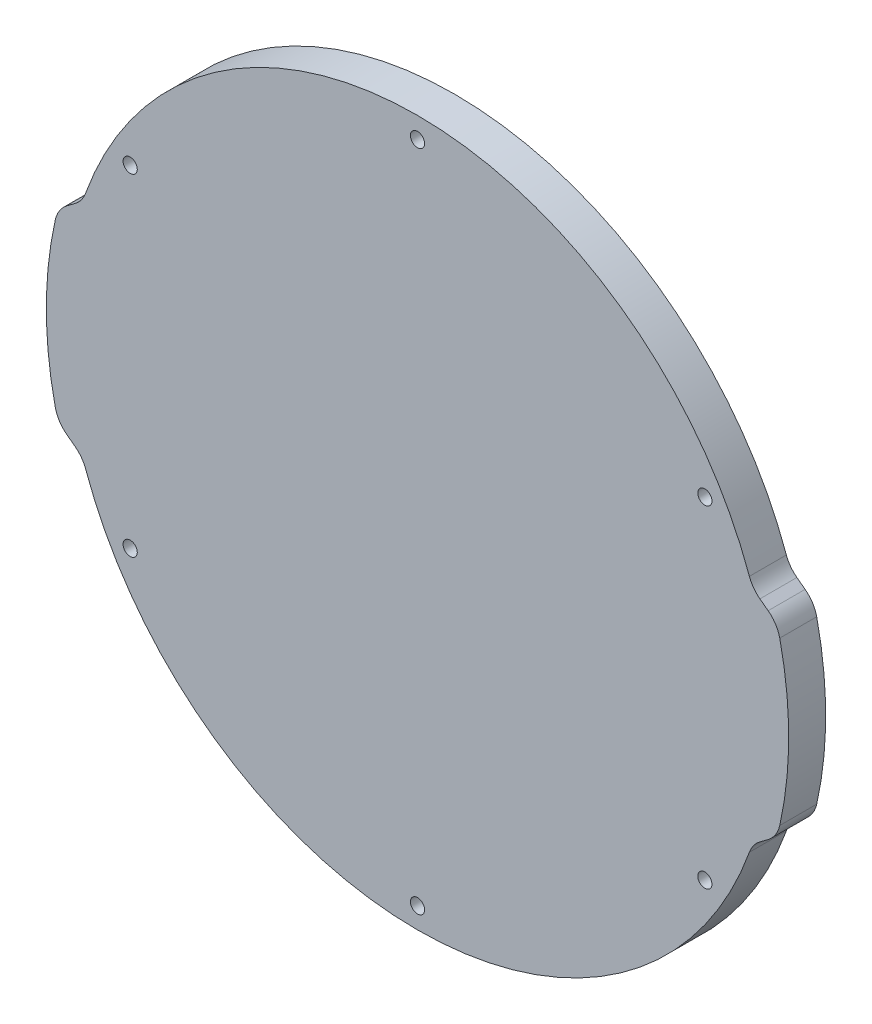
ISO-10303-21;
HEADER;
FILE_DESCRIPTION(('STEP AP214'),'2;1');
FILE_NAME('part.step','',(''),(''),'','','');
FILE_SCHEMA(('AUTOMOTIVE_DESIGN { 1 0 10303 214 1 1 1 1 }'));
ENDSEC;
DATA;
#1=APPLICATION_CONTEXT('core data for automotive mechanical design processes');
#2=APPLICATION_PROTOCOL_DEFINITION('international standard','automotive_design',2000,#1);
#3=PRODUCT_CONTEXT('',#1,'mechanical');
#4=PRODUCT('Part','Part','',(#3));
#5=PRODUCT_RELATED_PRODUCT_CATEGORY('part','',(#4));
#6=PRODUCT_DEFINITION_FORMATION('','',#4);
#7=PRODUCT_DEFINITION_CONTEXT('part definition',#1,'design');
#8=PRODUCT_DEFINITION('design','',#6,#7);
#9=PRODUCT_DEFINITION_SHAPE('','',#8);
#10=(LENGTH_UNIT() NAMED_UNIT(*) SI_UNIT(.MILLI.,.METRE.));
#11=(NAMED_UNIT(*) PLANE_ANGLE_UNIT() SI_UNIT($,.RADIAN.));
#12=(NAMED_UNIT(*) SI_UNIT($,.STERADIAN.) SOLID_ANGLE_UNIT());
#13=UNCERTAINTY_MEASURE_WITH_UNIT(LENGTH_MEASURE(1.E-05),#10,'distance_accuracy_value','');
#14=(GEOMETRIC_REPRESENTATION_CONTEXT(3) GLOBAL_UNCERTAINTY_ASSIGNED_CONTEXT((#13)) GLOBAL_UNIT_ASSIGNED_CONTEXT((#10,
#11,#12)) REPRESENTATION_CONTEXT('',''));
#15=CARTESIAN_POINT('',(0.,0.,0.));
#16=DIRECTION('',(0.,0.,1.));
#17=DIRECTION('',(1.,0.,0.));
#18=AXIS2_PLACEMENT_3D('',#15,#16,#17);
#19=CARTESIAN_POINT('',(0.,0.,6.));
#20=DIRECTION('',(0.,0.,1.));
#21=DIRECTION('',(1.,0.,0.));
#22=AXIS2_PLACEMENT_3D('',#19,#20,#21);
#23=PLANE('',#22);
#24=CARTESIAN_POINT('',(-46.6354679937874,-26.9250000000027,6.));
#25=DIRECTION('',(0.,0.,1.));
#26=DIRECTION('',(1.,0.,0.));
#27=AXIS2_PLACEMENT_3D('',#24,#25,#26);
#28=CIRCLE('',#27,1.15000000000566);
#29=CARTESIAN_POINT('',(-45.4854679937818,-26.9250000000027,6.));
#30=VERTEX_POINT('',#29);
#31=EDGE_CURVE('E317',#30,#30,#28,.T.);
#32=ORIENTED_EDGE('',*,*,#31,.F.);
#33=EDGE_LOOP('',(#32));
#34=FACE_BOUND('',#33,.T.);
#35=CARTESIAN_POINT('',(46.6354679937966,-26.9249999999973,6.));
#36=DIRECTION('',(0.,0.,1.));
#37=DIRECTION('',(1.,0.,0.));
#38=AXIS2_PLACEMENT_3D('',#35,#36,#37);
#39=CIRCLE('',#38,1.15000000000386);
#40=CARTESIAN_POINT('',(47.7854679938005,-26.9249999999973,6.));
#41=VERTEX_POINT('',#40);
#42=EDGE_CURVE('E305',#41,#41,#39,.T.);
#43=ORIENTED_EDGE('',*,*,#42,.F.);
#44=EDGE_LOOP('',(#43));
#45=FACE_BOUND('',#44,.T.);
#46=CARTESIAN_POINT('',(0.,53.85,6.));
#47=DIRECTION('',(0.,0.,1.));
#48=DIRECTION('',(1.,0.,0.));
#49=AXIS2_PLACEMENT_3D('',#46,#47,#48);
#50=CIRCLE('',#49,1.15);
#51=CARTESIAN_POINT('',(1.15,53.85,6.));
#52=VERTEX_POINT('',#51);
#53=EDGE_CURVE('E275',#52,#52,#50,.T.);
#54=ORIENTED_EDGE('',*,*,#53,.F.);
#55=EDGE_LOOP('',(#54));
#56=FACE_BOUND('',#55,.T.);
#57=DIRECTION('',(-0.800447556206134,-0.599402794257441,0.));
#58=VECTOR('',#57,1.);
#59=CARTESIAN_POINT('',(-58.3529133805674,15.,6.));
#60=LINE('',#59,#58);
#61=CARTESIAN_POINT('',(-55.5739785892829,17.0809624141399,6.));
#62=VERTEX_POINT('',#61);
#63=CARTESIAN_POINT('',(-56.9107570593107,16.0799364955455,6.));
#64=VERTEX_POINT('',#63);
#65=EDGE_CURVE('E168',#62,#64,#60,.T.);
#66=ORIENTED_EDGE('',*,*,#65,.T.);
#67=CARTESIAN_POINT('',(-53.9137430880235,12.0776987145149,6.));
#68=DIRECTION('',(0.,0.,1.));
#69=DIRECTION('',(1.,0.,0.));
#70=AXIS2_PLACEMENT_3D('',#67,#68,#69);
#71=CIRCLE('',#70,5.);
#72=CARTESIAN_POINT('',(-58.7928148606954,13.1707031230682,6.));
#73=VERTEX_POINT('',#72);
#74=EDGE_CURVE('E210',#64,#73,#71,.T.);
#75=ORIENTED_EDGE('',*,*,#74,.T.);
#76=CARTESIAN_POINT('',(0.,0.,6.));
#77=DIRECTION('',(0.,0.,1.));
#78=DIRECTION('',(1.,0.,0.));
#79=AXIS2_PLACEMENT_3D('',#76,#77,#78);
#80=CIRCLE('',#79,60.25);
#81=CARTESIAN_POINT('',(-58.7928148606953,-13.1707031230683,6.));
#82=VERTEX_POINT('',#81);
#83=EDGE_CURVE('E263',#73,#82,#80,.T.);
#84=ORIENTED_EDGE('',*,*,#83,.T.);
#85=CARTESIAN_POINT('',(-53.9137430880235,-12.0776987145149,6.));
#86=DIRECTION('',(0.,0.,1.));
#87=DIRECTION('',(1.,0.,0.));
#88=AXIS2_PLACEMENT_3D('',#85,#86,#87);
#89=CIRCLE('',#88,5.);
#90=CARTESIAN_POINT('',(-56.9107570593107,-16.0799364955456,6.));
#91=VERTEX_POINT('',#90);
#92=EDGE_CURVE('E56',#82,#91,#89,.T.);
#93=ORIENTED_EDGE('',*,*,#92,.T.);
#94=DIRECTION('',(0.800447556206134,-0.599402794257441,0.));
#95=VECTOR('',#94,1.);
#96=CARTESIAN_POINT('',(-58.3529133805674,-15.,6.));
#97=LINE('',#96,#95);
#98=CARTESIAN_POINT('',(-55.5739785892829,-17.08096241414,6.));
#99=VERTEX_POINT('',#98);
#100=EDGE_CURVE('E188',#91,#99,#97,.T.);
#101=ORIENTED_EDGE('',*,*,#100,.T.);
#102=CARTESIAN_POINT('',(-58.5709925605701,-21.0832001951707,6.));
#103=DIRECTION('',(0.,0.,1.));
#104=DIRECTION('',(1.,0.,0.));
#105=AXIS2_PLACEMENT_3D('',#102,#103,#104);
#106=CIRCLE('',#105,5.);
#107=CARTESIAN_POINT('',(-53.8664951661468,-19.3897704606188,6.));
#108=VERTEX_POINT('',#107);
#109=EDGE_CURVE('E238',#99,#108,#106,.F.);
#110=ORIENTED_EDGE('',*,*,#109,.T.);
#111=CARTESIAN_POINT('',(0.,0.,6.));
#112=DIRECTION('',(0.,0.,1.));
#113=DIRECTION('',(1.,0.,0.));
#114=AXIS2_PLACEMENT_3D('',#111,#112,#113);
#115=CIRCLE('',#114,57.25);
#116=CARTESIAN_POINT('',(53.8664951661468,-19.3897704606188,6.));
#117=VERTEX_POINT('',#116);
#118=EDGE_CURVE('E187',#108,#117,#115,.T.);
#119=ORIENTED_EDGE('',*,*,#118,.T.);
#120=CARTESIAN_POINT('',(58.5709925605701,-21.0832001951706,6.));
#121=DIRECTION('',(0.,0.,1.));
#122=DIRECTION('',(1.,0.,0.));
#123=AXIS2_PLACEMENT_3D('',#120,#121,#122);
#124=CIRCLE('',#123,5.);
#125=CARTESIAN_POINT('',(55.5739785892829,-17.0809624141399,6.));
#126=VERTEX_POINT('',#125);
#127=EDGE_CURVE('E242',#117,#126,#124,.F.);
#128=ORIENTED_EDGE('',*,*,#127,.T.);
#129=DIRECTION('',(0.800447556206134,0.599402794257441,0.));
#130=VECTOR('',#129,1.);
#131=CARTESIAN_POINT('',(54.3466880315627,-18.,6.));
#132=LINE('',#131,#130);
#133=CARTESIAN_POINT('',(56.9107570593107,-16.0799364955456,6.));
#134=VERTEX_POINT('',#133);
#135=EDGE_CURVE('E291',#126,#134,#132,.T.);
#136=ORIENTED_EDGE('',*,*,#135,.T.);
#137=CARTESIAN_POINT('',(53.9137430880235,-12.0776987145149,6.));
#138=DIRECTION('',(0.,0.,1.));
#139=DIRECTION('',(1.,0.,0.));
#140=AXIS2_PLACEMENT_3D('',#137,#138,#139);
#141=CIRCLE('',#140,5.);
#142=CARTESIAN_POINT('',(58.7928148606953,-13.1707031230683,6.));
#143=VERTEX_POINT('',#142);
#144=EDGE_CURVE('E207',#134,#143,#141,.T.);
#145=ORIENTED_EDGE('',*,*,#144,.T.);
#146=CARTESIAN_POINT('',(0.,0.,6.));
#147=DIRECTION('',(0.,0.,1.));
#148=DIRECTION('',(-1.,0.,0.));
#149=AXIS2_PLACEMENT_3D('',#146,#147,#148);
#150=CIRCLE('',#149,60.2500000000001);
#151=CARTESIAN_POINT('',(58.7928148606953,13.1707031230683,6.));
#152=VERTEX_POINT('',#151);
#153=EDGE_CURVE('E265',#143,#152,#150,.T.);
#154=ORIENTED_EDGE('',*,*,#153,.T.);
#155=CARTESIAN_POINT('',(53.9137430880235,12.0776987145149,6.));
#156=DIRECTION('',(0.,0.,1.));
#157=DIRECTION('',(1.,0.,0.));
#158=AXIS2_PLACEMENT_3D('',#155,#156,#157);
#159=CIRCLE('',#158,5.);
#160=CARTESIAN_POINT('',(56.9107570593107,16.0799364955455,6.));
#161=VERTEX_POINT('',#160);
#162=EDGE_CURVE('E205',#152,#161,#159,.T.);
#163=ORIENTED_EDGE('',*,*,#162,.T.);
#164=DIRECTION('',(-0.800447556206134,0.599402794257441,0.));
#165=VECTOR('',#164,1.);
#166=CARTESIAN_POINT('',(58.3529133805674,15.,6.));
#167=LINE('',#166,#165);
#168=CARTESIAN_POINT('',(55.5739785892829,17.0809624141399,6.));
#169=VERTEX_POINT('',#168);
#170=EDGE_CURVE('E259',#161,#169,#167,.T.);
#171=ORIENTED_EDGE('',*,*,#170,.T.);
#172=CARTESIAN_POINT('',(58.5709925605701,21.0832001951706,6.));
#173=DIRECTION('',(0.,0.,1.));
#174=DIRECTION('',(1.,0.,0.));
#175=AXIS2_PLACEMENT_3D('',#172,#173,#174);
#176=CIRCLE('',#175,5.);
#177=CARTESIAN_POINT('',(53.8664951661468,19.3897704606188,6.));
#178=VERTEX_POINT('',#177);
#179=EDGE_CURVE('E11',#169,#178,#176,.F.);
#180=ORIENTED_EDGE('',*,*,#179,.T.);
#181=CARTESIAN_POINT('',(0.,0.,6.));
#182=DIRECTION('',(0.,0.,1.));
#183=DIRECTION('',(-1.,0.,0.));
#184=AXIS2_PLACEMENT_3D('',#181,#182,#183);
#185=CIRCLE('',#184,57.25);
#186=CARTESIAN_POINT('',(-53.8664951661468,19.3897704606188,6.));
#187=VERTEX_POINT('',#186);
#188=EDGE_CURVE('E258',#178,#187,#185,.T.);
#189=ORIENTED_EDGE('',*,*,#188,.T.);
#190=CARTESIAN_POINT('',(-58.5709925605701,21.0832001951706,6.));
#191=DIRECTION('',(0.,0.,1.));
#192=DIRECTION('',(1.,0.,0.));
#193=AXIS2_PLACEMENT_3D('',#190,#191,#192);
#194=CIRCLE('',#193,5.);
#195=EDGE_CURVE('E158',#187,#62,#194,.F.);
#196=ORIENTED_EDGE('',*,*,#195,.T.);
#197=EDGE_LOOP('',(#66,#75,#84,#93,#101,#110,#119,#128,#136,#145,#154,#163,#171,#180,#189,#196));
#198=FACE_BOUND('',#197,.T.);
#199=CARTESIAN_POINT('',(46.6354679937935,26.9250000000027,6.));
#200=DIRECTION('',(0.,0.,1.));
#201=DIRECTION('',(1.,0.,0.));
#202=AXIS2_PLACEMENT_3D('',#199,#200,#201);
#203=CIRCLE('',#202,1.15000000000082);
#204=CARTESIAN_POINT('',(47.7854679937944,26.9250000000027,6.));
#205=VERTEX_POINT('',#204);
#206=EDGE_CURVE('E299',#205,#205,#203,.T.);
#207=ORIENTED_EDGE('',*,*,#206,.F.);
#208=EDGE_LOOP('',(#207));
#209=FACE_BOUND('',#208,.T.);
#210=CARTESIAN_POINT('',(6.10884676528221E-12,-53.85,6.));
#211=DIRECTION('',(0.,0.,1.));
#212=DIRECTION('',(1.,0.,0.));
#213=AXIS2_PLACEMENT_3D('',#210,#211,#212);
#214=CIRCLE('',#213,1.1500000000062);
#215=CARTESIAN_POINT('',(1.15000000001231,-53.85,6.));
#216=VERTEX_POINT('',#215);
#217=EDGE_CURVE('E311',#216,#216,#214,.T.);
#218=ORIENTED_EDGE('',*,*,#217,.F.);
#219=EDGE_LOOP('',(#218));
#220=FACE_BOUND('',#219,.T.);
#221=CARTESIAN_POINT('',(-46.6354679937905,26.9249999999973,6.));
#222=DIRECTION('',(0.,0.,1.));
#223=DIRECTION('',(1.,0.,0.));
#224=AXIS2_PLACEMENT_3D('',#221,#222,#223);
#225=CIRCLE('',#224,1.15000000000287);
#226=CARTESIAN_POINT('',(-45.4854679937876,26.9249999999973,6.));
#227=VERTEX_POINT('',#226);
#228=EDGE_CURVE('E323',#227,#227,#225,.T.);
#229=ORIENTED_EDGE('',*,*,#228,.F.);
#230=EDGE_LOOP('',(#229));
#231=FACE_BOUND('',#230,.T.);
#232=ADVANCED_FACE('F34',(#34,#45,#56,#198,#209,#220,#231),#23,.T.);
#233=CARTESIAN_POINT('',(0.,0.,0.));
#234=DIRECTION('',(0.,0.,1.));
#235=DIRECTION('',(1.,0.,0.));
#236=AXIS2_PLACEMENT_3D('',#233,#234,#235);
#237=PLANE('',#236);
#238=CARTESIAN_POINT('',(0.,0.,0.));
#239=DIRECTION('',(0.,0.,1.));
#240=DIRECTION('',(1.,0.,0.));
#241=AXIS2_PLACEMENT_3D('',#238,#239,#240);
#242=CIRCLE('',#241,60.25);
#243=CARTESIAN_POINT('',(-58.7928148606954,13.1707031230682,0.));
#244=VERTEX_POINT('',#243);
#245=CARTESIAN_POINT('',(-58.7928148606953,-13.1707031230683,0.));
#246=VERTEX_POINT('',#245);
#247=EDGE_CURVE('E176',#244,#246,#242,.T.);
#248=ORIENTED_EDGE('',*,*,#247,.F.);
#249=CARTESIAN_POINT('',(-53.9137430880235,12.0776987145149,0.));
#250=DIRECTION('',(0.,0.,1.));
#251=DIRECTION('',(1.,0.,0.));
#252=AXIS2_PLACEMENT_3D('',#249,#250,#251);
#253=CIRCLE('',#252,5.);
#254=CARTESIAN_POINT('',(-56.9107570593107,16.0799364955455,0.));
#255=VERTEX_POINT('',#254);
#256=EDGE_CURVE('E175',#244,#255,#253,.F.);
#257=ORIENTED_EDGE('',*,*,#256,.T.);
#258=DIRECTION('',(-0.800447556206134,-0.599402794257441,0.));
#259=VECTOR('',#258,1.);
#260=CARTESIAN_POINT('',(-58.3529133805674,15.,0.));
#261=LINE('',#260,#259);
#262=CARTESIAN_POINT('',(-55.5739785892829,17.0809624141399,0.));
#263=VERTEX_POINT('',#262);
#264=EDGE_CURVE('E165',#263,#255,#261,.T.);
#265=ORIENTED_EDGE('',*,*,#264,.F.);
#266=CARTESIAN_POINT('',(-58.5709925605701,21.0832001951706,0.));
#267=DIRECTION('',(0.,0.,1.));
#268=DIRECTION('',(1.,0.,0.));
#269=AXIS2_PLACEMENT_3D('',#266,#267,#268);
#270=CIRCLE('',#269,5.);
#271=CARTESIAN_POINT('',(-53.8664951661468,19.3897704606188,0.));
#272=VERTEX_POINT('',#271);
#273=EDGE_CURVE('E148',#263,#272,#270,.T.);
#274=ORIENTED_EDGE('',*,*,#273,.T.);
#275=CARTESIAN_POINT('',(0.,0.,0.));
#276=DIRECTION('',(0.,0.,1.));
#277=DIRECTION('',(-1.,0.,0.));
#278=AXIS2_PLACEMENT_3D('',#275,#276,#277);
#279=CIRCLE('',#278,57.25);
#280=CARTESIAN_POINT('',(53.8664951661468,19.3897704606188,0.));
#281=VERTEX_POINT('',#280);
#282=EDGE_CURVE('E177',#281,#272,#279,.T.);
#283=ORIENTED_EDGE('',*,*,#282,.F.);
#284=CARTESIAN_POINT('',(58.5709925605701,21.0832001951706,0.));
#285=DIRECTION('',(0.,0.,1.));
#286=DIRECTION('',(1.,0.,0.));
#287=AXIS2_PLACEMENT_3D('',#284,#285,#286);
#288=CIRCLE('',#287,5.);
#289=CARTESIAN_POINT('',(55.5739785892829,17.0809624141399,0.));
#290=VERTEX_POINT('',#289);
#291=EDGE_CURVE('E42',#281,#290,#288,.T.);
#292=ORIENTED_EDGE('',*,*,#291,.T.);
#293=DIRECTION('',(-0.800447556206134,0.599402794257441,0.));
#294=VECTOR('',#293,1.);
#295=CARTESIAN_POINT('',(58.3529133805674,15.,0.));
#296=LINE('',#295,#294);
#297=CARTESIAN_POINT('',(56.9107570593107,16.0799364955455,0.));
#298=VERTEX_POINT('',#297);
#299=EDGE_CURVE('E182',#298,#290,#296,.T.);
#300=ORIENTED_EDGE('',*,*,#299,.F.);
#301=CARTESIAN_POINT('',(53.9137430880235,12.0776987145149,0.));
#302=DIRECTION('',(0.,0.,1.));
#303=DIRECTION('',(1.,0.,0.));
#304=AXIS2_PLACEMENT_3D('',#301,#302,#303);
#305=CIRCLE('',#304,5.);
#306=CARTESIAN_POINT('',(58.7928148606953,13.1707031230683,0.));
#307=VERTEX_POINT('',#306);
#308=EDGE_CURVE('E198',#298,#307,#305,.F.);
#309=ORIENTED_EDGE('',*,*,#308,.T.);
#310=CARTESIAN_POINT('',(0.,0.,0.));
#311=DIRECTION('',(0.,0.,1.));
#312=DIRECTION('',(-1.,0.,0.));
#313=AXIS2_PLACEMENT_3D('',#310,#311,#312);
#314=CIRCLE('',#313,60.2500000000001);
#315=CARTESIAN_POINT('',(58.7928148606953,-13.1707031230683,0.));
#316=VERTEX_POINT('',#315);
#317=EDGE_CURVE('E253',#316,#307,#314,.T.);
#318=ORIENTED_EDGE('',*,*,#317,.F.);
#319=CARTESIAN_POINT('',(53.9137430880235,-12.0776987145149,0.));
#320=DIRECTION('',(0.,0.,1.));
#321=DIRECTION('',(1.,0.,0.));
#322=AXIS2_PLACEMENT_3D('',#319,#320,#321);
#323=CIRCLE('',#322,5.);
#324=CARTESIAN_POINT('',(56.9107570593107,-16.0799364955456,0.));
#325=VERTEX_POINT('',#324);
#326=EDGE_CURVE('E200',#316,#325,#323,.F.);
#327=ORIENTED_EDGE('',*,*,#326,.T.);
#328=DIRECTION('',(0.800447556206134,0.599402794257441,0.));
#329=VECTOR('',#328,1.);
#330=CARTESIAN_POINT('',(54.3466880315627,-18.,0.));
#331=LINE('',#330,#329);
#332=CARTESIAN_POINT('',(55.5739785892829,-17.0809624141399,0.));
#333=VERTEX_POINT('',#332);
#334=EDGE_CURVE('E274',#333,#325,#331,.T.);
#335=ORIENTED_EDGE('',*,*,#334,.F.);
#336=CARTESIAN_POINT('',(58.5709925605701,-21.0832001951706,0.));
#337=DIRECTION('',(0.,0.,1.));
#338=DIRECTION('',(1.,0.,0.));
#339=AXIS2_PLACEMENT_3D('',#336,#337,#338);
#340=CIRCLE('',#339,5.);
#341=CARTESIAN_POINT('',(53.8664951661468,-19.3897704606188,0.));
#342=VERTEX_POINT('',#341);
#343=EDGE_CURVE('E240',#333,#342,#340,.T.);
#344=ORIENTED_EDGE('',*,*,#343,.T.);
#345=CARTESIAN_POINT('',(0.,0.,0.));
#346=DIRECTION('',(0.,0.,1.));
#347=DIRECTION('',(1.,0.,0.));
#348=AXIS2_PLACEMENT_3D('',#345,#346,#347);
#349=CIRCLE('',#348,57.25);
#350=CARTESIAN_POINT('',(-53.8664951661468,-19.3897704606188,0.));
#351=VERTEX_POINT('',#350);
#352=EDGE_CURVE('E271',#351,#342,#349,.T.);
#353=ORIENTED_EDGE('',*,*,#352,.F.);
#354=CARTESIAN_POINT('',(-58.5709925605701,-21.0832001951707,0.));
#355=DIRECTION('',(0.,0.,1.));
#356=DIRECTION('',(1.,0.,0.));
#357=AXIS2_PLACEMENT_3D('',#354,#355,#356);
#358=CIRCLE('',#357,5.);
#359=CARTESIAN_POINT('',(-55.5739785892829,-17.08096241414,0.));
#360=VERTEX_POINT('',#359);
#361=EDGE_CURVE('E236',#351,#360,#358,.T.);
#362=ORIENTED_EDGE('',*,*,#361,.T.);
#363=DIRECTION('',(0.800447556206134,-0.599402794257441,0.));
#364=VECTOR('',#363,1.);
#365=CARTESIAN_POINT('',(-58.3529133805674,-15.,0.));
#366=LINE('',#365,#364);
#367=CARTESIAN_POINT('',(-56.9107570593107,-16.0799364955456,0.));
#368=VERTEX_POINT('',#367);
#369=EDGE_CURVE('E180',#368,#360,#366,.T.);
#370=ORIENTED_EDGE('',*,*,#369,.F.);
#371=CARTESIAN_POINT('',(-53.9137430880235,-12.0776987145149,0.));
#372=DIRECTION('',(0.,0.,1.));
#373=DIRECTION('',(1.,0.,0.));
#374=AXIS2_PLACEMENT_3D('',#371,#372,#373);
#375=CIRCLE('',#374,5.);
#376=EDGE_CURVE('E202',#368,#246,#375,.F.);
#377=ORIENTED_EDGE('',*,*,#376,.T.);
#378=EDGE_LOOP('',(#248,#257,#265,#274,#283,#292,#300,#309,#318,#327,#335,#344,#353,#362,#370,#377));
#379=FACE_BOUND('',#378,.T.);
#380=CARTESIAN_POINT('',(0.,53.85,0.));
#381=DIRECTION('',(0.,0.,1.));
#382=DIRECTION('',(1.,0.,0.));
#383=AXIS2_PLACEMENT_3D('',#380,#381,#382);
#384=CIRCLE('',#383,1.15);
#385=CARTESIAN_POINT('',(1.15,53.85,0.));
#386=VERTEX_POINT('',#385);
#387=EDGE_CURVE('E296',#386,#386,#384,.T.);
#388=ORIENTED_EDGE('',*,*,#387,.T.);
#389=EDGE_LOOP('',(#388));
#390=FACE_BOUND('',#389,.T.);
#391=CARTESIAN_POINT('',(46.6354679937935,26.9250000000027,0.));
#392=DIRECTION('',(0.,0.,1.));
#393=DIRECTION('',(1.,0.,0.));
#394=AXIS2_PLACEMENT_3D('',#391,#392,#393);
#395=CIRCLE('',#394,1.15000000000082);
#396=CARTESIAN_POINT('',(47.7854679937944,26.9250000000027,0.));
#397=VERTEX_POINT('',#396);
#398=EDGE_CURVE('E302',#397,#397,#395,.T.);
#399=ORIENTED_EDGE('',*,*,#398,.T.);
#400=EDGE_LOOP('',(#399));
#401=FACE_BOUND('',#400,.T.);
#402=CARTESIAN_POINT('',(46.6354679937966,-26.9249999999973,0.));
#403=DIRECTION('',(0.,0.,1.));
#404=DIRECTION('',(1.,0.,0.));
#405=AXIS2_PLACEMENT_3D('',#402,#403,#404);
#406=CIRCLE('',#405,1.15000000000386);
#407=CARTESIAN_POINT('',(47.7854679938005,-26.9249999999973,0.));
#408=VERTEX_POINT('',#407);
#409=EDGE_CURVE('E308',#408,#408,#406,.T.);
#410=ORIENTED_EDGE('',*,*,#409,.T.);
#411=EDGE_LOOP('',(#410));
#412=FACE_BOUND('',#411,.T.);
#413=CARTESIAN_POINT('',(6.10884676528221E-12,-53.85,0.));
#414=DIRECTION('',(0.,0.,1.));
#415=DIRECTION('',(1.,0.,0.));
#416=AXIS2_PLACEMENT_3D('',#413,#414,#415);
#417=CIRCLE('',#416,1.1500000000062);
#418=CARTESIAN_POINT('',(1.15000000001231,-53.85,0.));
#419=VERTEX_POINT('',#418);
#420=EDGE_CURVE('E314',#419,#419,#417,.T.);
#421=ORIENTED_EDGE('',*,*,#420,.T.);
#422=EDGE_LOOP('',(#421));
#423=FACE_BOUND('',#422,.T.);
#424=CARTESIAN_POINT('',(-46.6354679937874,-26.9250000000027,0.));
#425=DIRECTION('',(0.,0.,1.));
#426=DIRECTION('',(1.,0.,0.));
#427=AXIS2_PLACEMENT_3D('',#424,#425,#426);
#428=CIRCLE('',#427,1.15000000000566);
#429=CARTESIAN_POINT('',(-45.4854679937818,-26.9250000000027,0.));
#430=VERTEX_POINT('',#429);
#431=EDGE_CURVE('E320',#430,#430,#428,.T.);
#432=ORIENTED_EDGE('',*,*,#431,.T.);
#433=EDGE_LOOP('',(#432));
#434=FACE_BOUND('',#433,.T.);
#435=CARTESIAN_POINT('',(-46.6354679937905,26.9249999999973,0.));
#436=DIRECTION('',(0.,0.,1.));
#437=DIRECTION('',(1.,0.,0.));
#438=AXIS2_PLACEMENT_3D('',#435,#436,#437);
#439=CIRCLE('',#438,1.15000000000287);
#440=CARTESIAN_POINT('',(-45.4854679937876,26.9249999999973,0.));
#441=VERTEX_POINT('',#440);
#442=EDGE_CURVE('E326',#441,#441,#439,.T.);
#443=ORIENTED_EDGE('',*,*,#442,.T.);
#444=EDGE_LOOP('',(#443));
#445=FACE_BOUND('',#444,.T.);
#446=ADVANCED_FACE('F173',(#379,#390,#401,#412,#423,#434,#445),#237,.F.);
#447=CARTESIAN_POINT('',(0.,0.,6.));
#448=DIRECTION('',(0.,0.,-1.));
#449=DIRECTION('',(-1.,0.,0.));
#450=AXIS2_PLACEMENT_3D('',#447,#448,#449);
#451=CYLINDRICAL_SURFACE('',#450,57.25);
#452=ORIENTED_EDGE('',*,*,#118,.F.);
#453=DIRECTION('',(0.,0.,-1.));
#454=VECTOR('',#453,1.);
#455=CARTESIAN_POINT('',(-53.8664951661468,-19.3897704606188,6.));
#456=LINE('',#455,#454);
#457=EDGE_CURVE('E218',#108,#351,#456,.T.);
#458=ORIENTED_EDGE('',*,*,#457,.T.);
#459=ORIENTED_EDGE('',*,*,#352,.T.);
#460=DIRECTION('',(0.,0.,-1.));
#461=VECTOR('',#460,1.);
#462=CARTESIAN_POINT('',(53.8664951661468,-19.3897704606188,6.));
#463=LINE('',#462,#461);
#464=EDGE_CURVE('E216',#342,#117,#463,.F.);
#465=ORIENTED_EDGE('',*,*,#464,.T.);
#466=EDGE_LOOP('',(#452,#458,#459,#465));
#467=FACE_BOUND('',#466,.T.);
#468=ADVANCED_FACE('F341',(#467),#451,.T.);
#469=CARTESIAN_POINT('',(54.3466880315627,-18.,6.));
#470=DIRECTION('',(-0.599402794257441,0.800447556206134,0.));
#471=DIRECTION('',(-0.800447556206134,-0.599402794257441,0.));
#472=AXIS2_PLACEMENT_3D('',#469,#470,#471);
#473=PLANE('',#472);
#474=ORIENTED_EDGE('',*,*,#135,.F.);
#475=DIRECTION('',(0.,0.,1.));
#476=VECTOR('',#475,1.);
#477=CARTESIAN_POINT('',(55.5739785892829,-17.0809624141399,0.));
#478=LINE('',#477,#476);
#479=EDGE_CURVE('E223',#126,#333,#478,.F.);
#480=ORIENTED_EDGE('',*,*,#479,.T.);
#481=ORIENTED_EDGE('',*,*,#334,.T.);
#482=DIRECTION('',(0.,0.,-1.));
#483=VECTOR('',#482,1.);
#484=CARTESIAN_POINT('',(56.9107570593107,-16.0799364955456,6.));
#485=LINE('',#484,#483);
#486=EDGE_CURVE('E221',#325,#134,#485,.F.);
#487=ORIENTED_EDGE('',*,*,#486,.T.);
#488=EDGE_LOOP('',(#474,#480,#481,#487));
#489=FACE_BOUND('',#488,.T.);
#490=ADVANCED_FACE('F364',(#489),#473,.F.);
#491=CARTESIAN_POINT('',(0.,0.,6.));
#492=DIRECTION('',(0.,0.,-1.));
#493=DIRECTION('',(-1.,0.,0.));
#494=AXIS2_PLACEMENT_3D('',#491,#492,#493);
#495=CYLINDRICAL_SURFACE('',#494,60.2500000000001);
#496=ORIENTED_EDGE('',*,*,#153,.F.);
#497=DIRECTION('',(0.,0.,-1.));
#498=VECTOR('',#497,1.);
#499=CARTESIAN_POINT('',(58.7928148606953,-13.1707031230683,6.));
#500=LINE('',#499,#498);
#501=EDGE_CURVE('E228',#143,#316,#500,.T.);
#502=ORIENTED_EDGE('',*,*,#501,.T.);
#503=ORIENTED_EDGE('',*,*,#317,.T.);
#504=DIRECTION('',(0.,0.,-1.));
#505=VECTOR('',#504,1.);
#506=CARTESIAN_POINT('',(58.7928148606953,13.1707031230683,6.));
#507=LINE('',#506,#505);
#508=EDGE_CURVE('E226',#307,#152,#507,.F.);
#509=ORIENTED_EDGE('',*,*,#508,.T.);
#510=EDGE_LOOP('',(#496,#502,#503,#509));
#511=FACE_BOUND('',#510,.T.);
#512=ADVANCED_FACE('F283',(#511),#495,.T.);
#513=CARTESIAN_POINT('',(58.3529133805674,15.,6.));
#514=DIRECTION('',(-0.599402794257441,-0.800447556206134,0.));
#515=DIRECTION('',(0.800447556206134,-0.599402794257441,0.));
#516=AXIS2_PLACEMENT_3D('',#513,#514,#515);
#517=PLANE('',#516);
#518=ORIENTED_EDGE('',*,*,#170,.F.);
#519=DIRECTION('',(0.,0.,-1.));
#520=VECTOR('',#519,1.);
#521=CARTESIAN_POINT('',(56.9107570593107,16.0799364955455,6.));
#522=LINE('',#521,#520);
#523=EDGE_CURVE('E159',#161,#298,#522,.T.);
#524=ORIENTED_EDGE('',*,*,#523,.T.);
#525=ORIENTED_EDGE('',*,*,#299,.T.);
#526=DIRECTION('',(0.,0.,1.));
#527=VECTOR('',#526,1.);
#528=CARTESIAN_POINT('',(55.5739785892829,17.0809624141399,6.));
#529=LINE('',#528,#527);
#530=EDGE_CURVE('E231',#290,#169,#529,.T.);
#531=ORIENTED_EDGE('',*,*,#530,.T.);
#532=EDGE_LOOP('',(#518,#524,#525,#531));
#533=FACE_BOUND('',#532,.T.);
#534=ADVANCED_FACE('F250',(#533),#517,.F.);
#535=CARTESIAN_POINT('',(0.,0.,6.));
#536=DIRECTION('',(0.,0.,-1.));
#537=DIRECTION('',(-1.,0.,0.));
#538=AXIS2_PLACEMENT_3D('',#535,#536,#537);
#539=CYLINDRICAL_SURFACE('',#538,57.25);
#540=ORIENTED_EDGE('',*,*,#282,.T.);
#541=DIRECTION('',(0.,0.,-1.));
#542=VECTOR('',#541,1.);
#543=CARTESIAN_POINT('',(-53.8664951661468,19.3897704606188,6.));
#544=LINE('',#543,#542);
#545=EDGE_CURVE('E153',#272,#187,#544,.F.);
#546=ORIENTED_EDGE('',*,*,#545,.T.);
#547=ORIENTED_EDGE('',*,*,#188,.F.);
#548=DIRECTION('',(0.,0.,-1.));
#549=VECTOR('',#548,1.);
#550=CARTESIAN_POINT('',(53.8664951661468,19.3897704606188,6.));
#551=LINE('',#550,#549);
#552=EDGE_CURVE('E169',#178,#281,#551,.T.);
#553=ORIENTED_EDGE('',*,*,#552,.T.);
#554=EDGE_LOOP('',(#540,#546,#547,#553));
#555=FACE_BOUND('',#554,.T.);
#556=ADVANCED_FACE('F261',(#555),#539,.T.);
#557=CARTESIAN_POINT('',(-58.3529133805674,15.,6.));
#558=DIRECTION('',(0.599402794257441,-0.800447556206134,0.));
#559=DIRECTION('',(0.800447556206134,0.599402794257441,0.));
#560=AXIS2_PLACEMENT_3D('',#557,#558,#559);
#561=PLANE('',#560);
#562=ORIENTED_EDGE('',*,*,#65,.F.);
#563=DIRECTION('',(0.,0.,1.));
#564=VECTOR('',#563,1.);
#565=CARTESIAN_POINT('',(-55.5739785892829,17.0809624141399,0.));
#566=LINE('',#565,#564);
#567=EDGE_CURVE('E152',#62,#263,#566,.F.);
#568=ORIENTED_EDGE('',*,*,#567,.T.);
#569=ORIENTED_EDGE('',*,*,#264,.T.);
#570=DIRECTION('',(0.,0.,-1.));
#571=VECTOR('',#570,1.);
#572=CARTESIAN_POINT('',(-56.9107570593107,16.0799364955455,6.));
#573=LINE('',#572,#571);
#574=EDGE_CURVE('E170',#255,#64,#573,.F.);
#575=ORIENTED_EDGE('',*,*,#574,.T.);
#576=EDGE_LOOP('',(#562,#568,#569,#575));
#577=FACE_BOUND('',#576,.T.);
#578=ADVANCED_FACE('F164',(#577),#561,.F.);
#579=CARTESIAN_POINT('',(0.,0.,6.));
#580=DIRECTION('',(0.,0.,-1.));
#581=DIRECTION('',(-1.,0.,0.));
#582=AXIS2_PLACEMENT_3D('',#579,#580,#581);
#583=CYLINDRICAL_SURFACE('',#582,60.25);
#584=ORIENTED_EDGE('',*,*,#83,.F.);
#585=DIRECTION('',(0.,0.,-1.));
#586=VECTOR('',#585,1.);
#587=CARTESIAN_POINT('',(-58.7928148606954,13.1707031230682,6.));
#588=LINE('',#587,#586);
#589=EDGE_CURVE('E195',#73,#244,#588,.T.);
#590=ORIENTED_EDGE('',*,*,#589,.T.);
#591=ORIENTED_EDGE('',*,*,#247,.T.);
#592=DIRECTION('',(0.,0.,-1.));
#593=VECTOR('',#592,1.);
#594=CARTESIAN_POINT('',(-58.7928148606953,-13.1707031230683,6.));
#595=LINE('',#594,#593);
#596=EDGE_CURVE('E193',#246,#82,#595,.F.);
#597=ORIENTED_EDGE('',*,*,#596,.T.);
#598=EDGE_LOOP('',(#584,#590,#591,#597));
#599=FACE_BOUND('',#598,.T.);
#600=ADVANCED_FACE('F352',(#599),#583,.T.);
#601=CARTESIAN_POINT('',(-58.3529133805674,-15.,6.));
#602=DIRECTION('',(0.599402794257441,0.800447556206134,0.));
#603=DIRECTION('',(-0.800447556206134,0.599402794257441,0.));
#604=AXIS2_PLACEMENT_3D('',#601,#602,#603);
#605=PLANE('',#604);
#606=ORIENTED_EDGE('',*,*,#100,.F.);
#607=DIRECTION('',(0.,0.,-1.));
#608=VECTOR('',#607,1.);
#609=CARTESIAN_POINT('',(-56.9107570593107,-16.0799364955456,6.));
#610=LINE('',#609,#608);
#611=EDGE_CURVE('E213',#91,#368,#610,.T.);
#612=ORIENTED_EDGE('',*,*,#611,.T.);
#613=ORIENTED_EDGE('',*,*,#369,.T.);
#614=DIRECTION('',(0.,0.,1.));
#615=VECTOR('',#614,1.);
#616=CARTESIAN_POINT('',(-55.5739785892829,-17.08096241414,6.));
#617=LINE('',#616,#615);
#618=EDGE_CURVE('E49',#360,#99,#617,.T.);
#619=ORIENTED_EDGE('',*,*,#618,.T.);
#620=EDGE_LOOP('',(#606,#612,#613,#619));
#621=FACE_BOUND('',#620,.T.);
#622=ADVANCED_FACE('F349',(#621),#605,.F.);
#623=CARTESIAN_POINT('',(0.,53.85,6.));
#624=DIRECTION('',(0.,0.,-1.));
#625=DIRECTION('',(-1.,0.,0.));
#626=AXIS2_PLACEMENT_3D('',#623,#624,#625);
#627=CYLINDRICAL_SURFACE('',#626,1.15);
#628=ORIENTED_EDGE('',*,*,#53,.T.);
#629=EDGE_LOOP('',(#628));
#630=FACE_BOUND('',#629,.T.);
#631=ORIENTED_EDGE('',*,*,#387,.F.);
#632=EDGE_LOOP('',(#631));
#633=FACE_BOUND('',#632,.T.);
#634=ADVANCED_FACE('F346',(#630,#633),#627,.F.);
#635=CARTESIAN_POINT('',(46.6354679937935,26.9250000000027,6.));
#636=DIRECTION('',(0.,0.,-1.));
#637=DIRECTION('',(-1.,0.,0.));
#638=AXIS2_PLACEMENT_3D('',#635,#636,#637);
#639=CYLINDRICAL_SURFACE('',#638,1.15000000000082);
#640=ORIENTED_EDGE('',*,*,#206,.T.);
#641=EDGE_LOOP('',(#640));
#642=FACE_BOUND('',#641,.T.);
#643=ORIENTED_EDGE('',*,*,#398,.F.);
#644=EDGE_LOOP('',(#643));
#645=FACE_BOUND('',#644,.T.);
#646=ADVANCED_FACE('F536',(#642,#645),#639,.F.);
#647=CARTESIAN_POINT('',(46.6354679937966,-26.9249999999973,6.));
#648=DIRECTION('',(0.,0.,-1.));
#649=DIRECTION('',(-1.,0.,0.));
#650=AXIS2_PLACEMENT_3D('',#647,#648,#649);
#651=CYLINDRICAL_SURFACE('',#650,1.15000000000386);
#652=ORIENTED_EDGE('',*,*,#42,.T.);
#653=EDGE_LOOP('',(#652));
#654=FACE_BOUND('',#653,.T.);
#655=ORIENTED_EDGE('',*,*,#409,.F.);
#656=EDGE_LOOP('',(#655));
#657=FACE_BOUND('',#656,.T.);
#658=ADVANCED_FACE('F526',(#654,#657),#651,.F.);
#659=CARTESIAN_POINT('',(6.10884676528221E-12,-53.85,6.));
#660=DIRECTION('',(0.,0.,-1.));
#661=DIRECTION('',(-1.,0.,0.));
#662=AXIS2_PLACEMENT_3D('',#659,#660,#661);
#663=CYLINDRICAL_SURFACE('',#662,1.1500000000062);
#664=ORIENTED_EDGE('',*,*,#217,.T.);
#665=EDGE_LOOP('',(#664));
#666=FACE_BOUND('',#665,.T.);
#667=ORIENTED_EDGE('',*,*,#420,.F.);
#668=EDGE_LOOP('',(#667));
#669=FACE_BOUND('',#668,.T.);
#670=ADVANCED_FACE('F516',(#666,#669),#663,.F.);
#671=CARTESIAN_POINT('',(-46.6354679937874,-26.9250000000027,6.));
#672=DIRECTION('',(0.,0.,-1.));
#673=DIRECTION('',(-1.,0.,0.));
#674=AXIS2_PLACEMENT_3D('',#671,#672,#673);
#675=CYLINDRICAL_SURFACE('',#674,1.15000000000566);
#676=ORIENTED_EDGE('',*,*,#31,.T.);
#677=EDGE_LOOP('',(#676));
#678=FACE_BOUND('',#677,.T.);
#679=ORIENTED_EDGE('',*,*,#431,.F.);
#680=EDGE_LOOP('',(#679));
#681=FACE_BOUND('',#680,.T.);
#682=ADVANCED_FACE('F507',(#678,#681),#675,.F.);
#683=CARTESIAN_POINT('',(-46.6354679937905,26.9249999999973,6.));
#684=DIRECTION('',(0.,0.,-1.));
#685=DIRECTION('',(-1.,0.,0.));
#686=AXIS2_PLACEMENT_3D('',#683,#684,#685);
#687=CYLINDRICAL_SURFACE('',#686,1.15000000000287);
#688=ORIENTED_EDGE('',*,*,#228,.T.);
#689=EDGE_LOOP('',(#688));
#690=FACE_BOUND('',#689,.T.);
#691=ORIENTED_EDGE('',*,*,#442,.F.);
#692=EDGE_LOOP('',(#691));
#693=FACE_BOUND('',#692,.T.);
#694=ADVANCED_FACE('F332',(#690,#693),#687,.F.);
#695=CARTESIAN_POINT('',(-58.5709925605701,21.0832001951706,6.));
#696=DIRECTION('',(0.,0.,-1.));
#697=DIRECTION('',(-1.,0.,0.));
#698=AXIS2_PLACEMENT_3D('',#695,#696,#697);
#699=CYLINDRICAL_SURFACE('',#698,5.);
#700=ORIENTED_EDGE('',*,*,#195,.F.);
#701=ORIENTED_EDGE('',*,*,#545,.F.);
#702=ORIENTED_EDGE('',*,*,#273,.F.);
#703=ORIENTED_EDGE('',*,*,#567,.F.);
#704=EDGE_LOOP('',(#700,#701,#702,#703));
#705=FACE_BOUND('',#704,.T.);
#706=ADVANCED_FACE('F151',(#705),#699,.F.);
#707=CARTESIAN_POINT('',(-53.9137430880235,12.0776987145149,6.));
#708=DIRECTION('',(0.,0.,-1.));
#709=DIRECTION('',(-1.,0.,0.));
#710=AXIS2_PLACEMENT_3D('',#707,#708,#709);
#711=CYLINDRICAL_SURFACE('',#710,5.);
#712=ORIENTED_EDGE('',*,*,#74,.F.);
#713=ORIENTED_EDGE('',*,*,#574,.F.);
#714=ORIENTED_EDGE('',*,*,#256,.F.);
#715=ORIENTED_EDGE('',*,*,#589,.F.);
#716=EDGE_LOOP('',(#712,#713,#714,#715));
#717=FACE_BOUND('',#716,.T.);
#718=ADVANCED_FACE('F373',(#717),#711,.T.);
#719=CARTESIAN_POINT('',(-53.9137430880235,-12.0776987145149,6.));
#720=DIRECTION('',(0.,0.,-1.));
#721=DIRECTION('',(-1.,0.,0.));
#722=AXIS2_PLACEMENT_3D('',#719,#720,#721);
#723=CYLINDRICAL_SURFACE('',#722,5.);
#724=ORIENTED_EDGE('',*,*,#92,.F.);
#725=ORIENTED_EDGE('',*,*,#596,.F.);
#726=ORIENTED_EDGE('',*,*,#376,.F.);
#727=ORIENTED_EDGE('',*,*,#611,.F.);
#728=EDGE_LOOP('',(#724,#725,#726,#727));
#729=FACE_BOUND('',#728,.T.);
#730=ADVANCED_FACE('F376',(#729),#723,.T.);
#731=CARTESIAN_POINT('',(-58.5709925605701,-21.0832001951707,6.));
#732=DIRECTION('',(0.,0.,-1.));
#733=DIRECTION('',(-1.,0.,0.));
#734=AXIS2_PLACEMENT_3D('',#731,#732,#733);
#735=CYLINDRICAL_SURFACE('',#734,5.);
#736=ORIENTED_EDGE('',*,*,#109,.F.);
#737=ORIENTED_EDGE('',*,*,#618,.F.);
#738=ORIENTED_EDGE('',*,*,#361,.F.);
#739=ORIENTED_EDGE('',*,*,#457,.F.);
#740=EDGE_LOOP('',(#736,#737,#738,#739));
#741=FACE_BOUND('',#740,.T.);
#742=ADVANCED_FACE('F380',(#741),#735,.F.);
#743=CARTESIAN_POINT('',(58.5709925605701,-21.0832001951706,6.));
#744=DIRECTION('',(0.,0.,-1.));
#745=DIRECTION('',(-1.,0.,0.));
#746=AXIS2_PLACEMENT_3D('',#743,#744,#745);
#747=CYLINDRICAL_SURFACE('',#746,5.);
#748=ORIENTED_EDGE('',*,*,#127,.F.);
#749=ORIENTED_EDGE('',*,*,#464,.F.);
#750=ORIENTED_EDGE('',*,*,#343,.F.);
#751=ORIENTED_EDGE('',*,*,#479,.F.);
#752=EDGE_LOOP('',(#748,#749,#750,#751));
#753=FACE_BOUND('',#752,.T.);
#754=ADVANCED_FACE('F384',(#753),#747,.F.);
#755=CARTESIAN_POINT('',(53.9137430880235,-12.0776987145149,6.));
#756=DIRECTION('',(0.,0.,-1.));
#757=DIRECTION('',(-1.,0.,0.));
#758=AXIS2_PLACEMENT_3D('',#755,#756,#757);
#759=CYLINDRICAL_SURFACE('',#758,5.);
#760=ORIENTED_EDGE('',*,*,#144,.F.);
#761=ORIENTED_EDGE('',*,*,#486,.F.);
#762=ORIENTED_EDGE('',*,*,#326,.F.);
#763=ORIENTED_EDGE('',*,*,#501,.F.);
#764=EDGE_LOOP('',(#760,#761,#762,#763));
#765=FACE_BOUND('',#764,.T.);
#766=ADVANCED_FACE('F388',(#765),#759,.T.);
#767=CARTESIAN_POINT('',(53.9137430880235,12.0776987145149,6.));
#768=DIRECTION('',(0.,0.,-1.));
#769=DIRECTION('',(-1.,0.,0.));
#770=AXIS2_PLACEMENT_3D('',#767,#768,#769);
#771=CYLINDRICAL_SURFACE('',#770,5.);
#772=ORIENTED_EDGE('',*,*,#162,.F.);
#773=ORIENTED_EDGE('',*,*,#508,.F.);
#774=ORIENTED_EDGE('',*,*,#308,.F.);
#775=ORIENTED_EDGE('',*,*,#523,.F.);
#776=EDGE_LOOP('',(#772,#773,#774,#775));
#777=FACE_BOUND('',#776,.T.);
#778=ADVANCED_FACE('F288',(#777),#771,.T.);
#779=CARTESIAN_POINT('',(58.5709925605701,21.0832001951706,6.));
#780=DIRECTION('',(0.,0.,-1.));
#781=DIRECTION('',(-1.,0.,0.));
#782=AXIS2_PLACEMENT_3D('',#779,#780,#781);
#783=CYLINDRICAL_SURFACE('',#782,5.);
#784=ORIENTED_EDGE('',*,*,#179,.F.);
#785=ORIENTED_EDGE('',*,*,#530,.F.);
#786=ORIENTED_EDGE('',*,*,#291,.F.);
#787=ORIENTED_EDGE('',*,*,#552,.F.);
#788=EDGE_LOOP('',(#784,#785,#786,#787));
#789=FACE_BOUND('',#788,.T.);
#790=ADVANCED_FACE('F36',(#789),#783,.F.);
#791=CLOSED_SHELL('',(#232,#446,#468,#490,#512,#534,#556,#578,#600,#622,#634,#646,#658,#670,
#682,#694,#706,#718,#730,#742,#754,#766,#778,#790));
#792=MANIFOLD_SOLID_BREP('B2',#791);
#793=ADVANCED_BREP_SHAPE_REPRESENTATION('',(#18,#792),#14);
#794=SHAPE_DEFINITION_REPRESENTATION(#9,#793);
ENDSEC;
END-ISO-10303-21;
